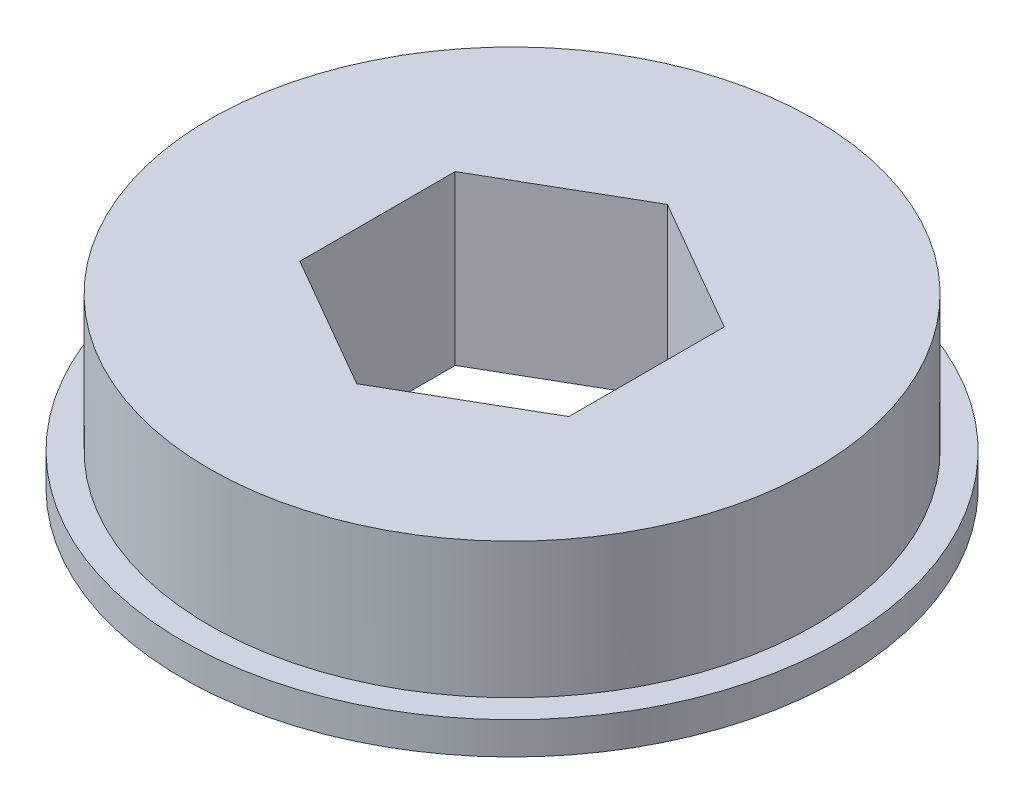
ISO-10303-21;
HEADER;
FILE_DESCRIPTION(('STEP AP214'),'2;1');
FILE_NAME('part.step','',(''),(''),'','','');
FILE_SCHEMA(('AUTOMOTIVE_DESIGN { 1 0 10303 214 1 1 1 1 }'));
ENDSEC;
DATA;
#1=APPLICATION_CONTEXT('core data for automotive mechanical design processes');
#2=APPLICATION_PROTOCOL_DEFINITION('international standard','automotive_design',2000,#1);
#3=PRODUCT_CONTEXT('',#1,'mechanical');
#4=PRODUCT('Part','Part','',(#3));
#5=PRODUCT_RELATED_PRODUCT_CATEGORY('part','',(#4));
#6=PRODUCT_DEFINITION_FORMATION('','',#4);
#7=PRODUCT_DEFINITION_CONTEXT('part definition',#1,'design');
#8=PRODUCT_DEFINITION('design','',#6,#7);
#9=PRODUCT_DEFINITION_SHAPE('','',#8);
#10=(LENGTH_UNIT() NAMED_UNIT(*) SI_UNIT(.MILLI.,.METRE.));
#11=(NAMED_UNIT(*) PLANE_ANGLE_UNIT() SI_UNIT($,.RADIAN.));
#12=(NAMED_UNIT(*) SI_UNIT($,.STERADIAN.) SOLID_ANGLE_UNIT());
#13=UNCERTAINTY_MEASURE_WITH_UNIT(LENGTH_MEASURE(1.E-05),#10,'distance_accuracy_value','');
#14=(GEOMETRIC_REPRESENTATION_CONTEXT(3) GLOBAL_UNCERTAINTY_ASSIGNED_CONTEXT((#13)) GLOBAL_UNIT_ASSIGNED_CONTEXT((#10,
#11,#12)) REPRESENTATION_CONTEXT('',''));
#15=CARTESIAN_POINT('',(0.,0.,0.));
#16=DIRECTION('',(0.,0.,1.));
#17=DIRECTION('',(1.,0.,0.));
#18=AXIS2_PLACEMENT_3D('',#15,#16,#17);
#19=CARTESIAN_POINT('',(0.,7.9248,0.));
#20=DIRECTION('',(0.,-1.,0.));
#21=DIRECTION('',(0.,0.,-1.));
#22=AXIS2_PLACEMENT_3D('',#19,#20,#21);
#23=CYLINDRICAL_SURFACE('',#22,14.2875);
#24=CARTESIAN_POINT('',(0.,7.9248,0.));
#25=DIRECTION('',(0.,1.,0.));
#26=DIRECTION('',(0.,0.,1.));
#27=AXIS2_PLACEMENT_3D('',#24,#25,#26);
#28=CIRCLE('',#27,14.2875);
#29=CARTESIAN_POINT('',(0.,7.9248,14.2875));
#30=VERTEX_POINT('',#29);
#31=EDGE_CURVE('E44',#30,#30,#28,.T.);
#32=ORIENTED_EDGE('',*,*,#31,.F.);
#33=EDGE_LOOP('',(#32));
#34=FACE_BOUND('',#33,.T.);
#35=CARTESIAN_POINT('',(0.,1.524,0.));
#36=DIRECTION('',(0.,-1.,0.));
#37=DIRECTION('',(0.,0.,-1.));
#38=AXIS2_PLACEMENT_3D('',#35,#36,#37);
#39=CIRCLE('',#38,14.2875);
#40=CARTESIAN_POINT('',(0.,1.524,-14.2875));
#41=VERTEX_POINT('',#40);
#42=EDGE_CURVE('E11',#41,#41,#39,.T.);
#43=ORIENTED_EDGE('',*,*,#42,.F.);
#44=EDGE_LOOP('',(#43));
#45=FACE_BOUND('',#44,.T.);
#46=ADVANCED_FACE('F37',(#34,#45),#23,.T.);
#47=CARTESIAN_POINT('',(0.,7.9248,0.));
#48=DIRECTION('',(0.,1.,0.));
#49=DIRECTION('',(0.,0.,1.));
#50=AXIS2_PLACEMENT_3D('',#47,#48,#49);
#51=PLANE('',#50);
#52=ORIENTED_EDGE('',*,*,#31,.T.);
#53=EDGE_LOOP('',(#52));
#54=FACE_BOUND('',#53,.T.);
#55=DIRECTION('',(0.,0.,-1.));
#56=VECTOR('',#55,1.);
#57=CARTESIAN_POINT('',(6.35,7.9248,3.66617420935413));
#58=LINE('',#57,#56);
#59=CARTESIAN_POINT('',(6.35,7.9248,3.66617420935413));
#60=VERTEX_POINT('',#59);
#61=CARTESIAN_POINT('',(6.35,7.9248,-3.66617420935412));
#62=VERTEX_POINT('',#61);
#63=EDGE_CURVE('E97',#60,#62,#58,.T.);
#64=ORIENTED_EDGE('',*,*,#63,.F.);
#65=DIRECTION('',(0.866025403784439,0.,-0.499999999999999));
#66=VECTOR('',#65,1.);
#67=CARTESIAN_POINT('',(0.,7.9248,7.33234841870825));
#68=LINE('',#67,#66);
#69=CARTESIAN_POINT('',(0.,7.9248,7.33234841870825));
#70=VERTEX_POINT('',#69);
#71=EDGE_CURVE('E89',#70,#60,#68,.T.);
#72=ORIENTED_EDGE('',*,*,#71,.F.);
#73=DIRECTION('',(0.866025403784438,0.,0.5));
#74=VECTOR('',#73,1.);
#75=CARTESIAN_POINT('',(-6.35,7.9248,3.66617420935412));
#76=LINE('',#75,#74);
#77=CARTESIAN_POINT('',(-6.35,7.9248,3.66617420935412));
#78=VERTEX_POINT('',#77);
#79=EDGE_CURVE('E119',#78,#70,#76,.T.);
#80=ORIENTED_EDGE('',*,*,#79,.F.);
#81=DIRECTION('',(0.,0.,1.));
#82=VECTOR('',#81,1.);
#83=CARTESIAN_POINT('',(-6.35,7.9248,-3.66617420935413));
#84=LINE('',#83,#82);
#85=CARTESIAN_POINT('',(-6.35,7.9248,-3.66617420935413));
#86=VERTEX_POINT('',#85);
#87=EDGE_CURVE('E117',#86,#78,#84,.T.);
#88=ORIENTED_EDGE('',*,*,#87,.F.);
#89=DIRECTION('',(-0.866025403784439,0.,0.499999999999999));
#90=VECTOR('',#89,1.);
#91=CARTESIAN_POINT('',(0.,7.9248,-7.33234841870825));
#92=LINE('',#91,#90);
#93=CARTESIAN_POINT('',(0.,7.9248,-7.33234841870825));
#94=VERTEX_POINT('',#93);
#95=EDGE_CURVE('E112',#94,#86,#92,.T.);
#96=ORIENTED_EDGE('',*,*,#95,.F.);
#97=DIRECTION('',(-0.866025403784438,0.,-0.500000000000001));
#98=VECTOR('',#97,1.);
#99=CARTESIAN_POINT('',(6.35,7.9248,-3.66617420935412));
#100=LINE('',#99,#98);
#101=EDGE_CURVE('E110',#62,#94,#100,.T.);
#102=ORIENTED_EDGE('',*,*,#101,.F.);
#103=EDGE_LOOP('',(#64,#72,#80,#88,#96,#102));
#104=FACE_BOUND('',#103,.T.);
#105=ADVANCED_FACE('F108',(#54,#104),#51,.T.);
#106=CARTESIAN_POINT('',(0.,0.,0.));
#107=DIRECTION('',(0.,1.,0.));
#108=DIRECTION('',(0.,0.,1.));
#109=AXIS2_PLACEMENT_3D('',#106,#107,#108);
#110=PLANE('',#109);
#111=DIRECTION('',(0.866025403784439,0.,-0.499999999999999));
#112=VECTOR('',#111,1.);
#113=CARTESIAN_POINT('',(0.,0.,7.33234841870825));
#114=LINE('',#113,#112);
#115=CARTESIAN_POINT('',(0.,0.,7.33234841870825));
#116=VERTEX_POINT('',#115);
#117=CARTESIAN_POINT('',(6.35,0.,3.66617420935413));
#118=VERTEX_POINT('',#117);
#119=EDGE_CURVE('E59',#116,#118,#114,.T.);
#120=ORIENTED_EDGE('',*,*,#119,.T.);
#121=DIRECTION('',(0.,0.,-1.));
#122=VECTOR('',#121,1.);
#123=CARTESIAN_POINT('',(6.35,0.,3.66617420935413));
#124=LINE('',#123,#122);
#125=CARTESIAN_POINT('',(6.35,0.,-3.66617420935412));
#126=VERTEX_POINT('',#125);
#127=EDGE_CURVE('E104',#118,#126,#124,.T.);
#128=ORIENTED_EDGE('',*,*,#127,.T.);
#129=DIRECTION('',(-0.866025403784438,0.,-0.500000000000001));
#130=VECTOR('',#129,1.);
#131=CARTESIAN_POINT('',(6.35,0.,-3.66617420935412));
#132=LINE('',#131,#130);
#133=CARTESIAN_POINT('',(0.,0.,-7.33234841870825));
#134=VERTEX_POINT('',#133);
#135=EDGE_CURVE('E124',#126,#134,#132,.T.);
#136=ORIENTED_EDGE('',*,*,#135,.T.);
#137=DIRECTION('',(-0.866025403784439,0.,0.499999999999999));
#138=VECTOR('',#137,1.);
#139=CARTESIAN_POINT('',(0.,0.,-7.33234841870825));
#140=LINE('',#139,#138);
#141=CARTESIAN_POINT('',(-6.35,0.,-3.66617420935413));
#142=VERTEX_POINT('',#141);
#143=EDGE_CURVE('E127',#134,#142,#140,.T.);
#144=ORIENTED_EDGE('',*,*,#143,.T.);
#145=DIRECTION('',(0.,0.,1.));
#146=VECTOR('',#145,1.);
#147=CARTESIAN_POINT('',(-6.35,0.,-3.66617420935413));
#148=LINE('',#147,#146);
#149=CARTESIAN_POINT('',(-6.35,0.,3.66617420935412));
#150=VERTEX_POINT('',#149);
#151=EDGE_CURVE('E130',#142,#150,#148,.T.);
#152=ORIENTED_EDGE('',*,*,#151,.T.);
#153=DIRECTION('',(0.866025403784438,0.,0.5));
#154=VECTOR('',#153,1.);
#155=CARTESIAN_POINT('',(-6.35,0.,3.66617420935412));
#156=LINE('',#155,#154);
#157=EDGE_CURVE('E98',#150,#116,#156,.T.);
#158=ORIENTED_EDGE('',*,*,#157,.T.);
#159=EDGE_LOOP('',(#120,#128,#136,#144,#152,#158));
#160=FACE_BOUND('',#159,.T.);
#161=CARTESIAN_POINT('',(0.,0.,0.));
#162=DIRECTION('',(0.,-1.,0.));
#163=DIRECTION('',(0.,0.,-1.));
#164=AXIS2_PLACEMENT_3D('',#161,#162,#163);
#165=CIRCLE('',#164,15.5575);
#166=CARTESIAN_POINT('',(0.,0.,-15.5575));
#167=VERTEX_POINT('',#166);
#168=EDGE_CURVE('E157',#167,#167,#165,.T.);
#169=ORIENTED_EDGE('',*,*,#168,.T.);
#170=EDGE_LOOP('',(#169));
#171=FACE_BOUND('',#170,.T.);
#172=ADVANCED_FACE('F162',(#160,#171),#110,.F.);
#173=CARTESIAN_POINT('',(0.,7.9248,7.33234841870825));
#174=DIRECTION('',(-0.499999999999999,0.,-0.866025403784439));
#175=DIRECTION('',(-0.866025403784439,0.,0.499999999999999));
#176=AXIS2_PLACEMENT_3D('',#173,#174,#175);
#177=PLANE('',#176);
#178=ORIENTED_EDGE('',*,*,#119,.F.);
#179=DIRECTION('',(0.,-1.,0.));
#180=VECTOR('',#179,1.);
#181=CARTESIAN_POINT('',(0.,7.9248,7.33234841870825));
#182=LINE('',#181,#180);
#183=EDGE_CURVE('E93',#70,#116,#182,.T.);
#184=ORIENTED_EDGE('',*,*,#183,.F.);
#185=ORIENTED_EDGE('',*,*,#71,.T.);
#186=DIRECTION('',(0.,-1.,0.));
#187=VECTOR('',#186,1.);
#188=CARTESIAN_POINT('',(6.35,7.9248,3.66617420935413));
#189=LINE('',#188,#187);
#190=EDGE_CURVE('E92',#60,#118,#189,.T.);
#191=ORIENTED_EDGE('',*,*,#190,.T.);
#192=EDGE_LOOP('',(#178,#184,#185,#191));
#193=FACE_BOUND('',#192,.T.);
#194=ADVANCED_FACE('F91',(#193),#177,.T.);
#195=CARTESIAN_POINT('',(6.35,7.9248,3.66617420935413));
#196=DIRECTION('',(-1.,0.,0.));
#197=DIRECTION('',(0.,0.,1.));
#198=AXIS2_PLACEMENT_3D('',#195,#196,#197);
#199=PLANE('',#198);
#200=ORIENTED_EDGE('',*,*,#127,.F.);
#201=ORIENTED_EDGE('',*,*,#190,.F.);
#202=ORIENTED_EDGE('',*,*,#63,.T.);
#203=DIRECTION('',(0.,-1.,0.));
#204=VECTOR('',#203,1.);
#205=CARTESIAN_POINT('',(6.35,7.9248,-3.66617420935412));
#206=LINE('',#205,#204);
#207=EDGE_CURVE('E105',#62,#126,#206,.T.);
#208=ORIENTED_EDGE('',*,*,#207,.T.);
#209=EDGE_LOOP('',(#200,#201,#202,#208));
#210=FACE_BOUND('',#209,.T.);
#211=ADVANCED_FACE('F101',(#210),#199,.T.);
#212=CARTESIAN_POINT('',(6.35,7.9248,-3.66617420935412));
#213=DIRECTION('',(-0.500000000000001,0.,0.866025403784438));
#214=DIRECTION('',(0.866025403784438,0.,0.500000000000001));
#215=AXIS2_PLACEMENT_3D('',#212,#213,#214);
#216=PLANE('',#215);
#217=ORIENTED_EDGE('',*,*,#135,.F.);
#218=ORIENTED_EDGE('',*,*,#207,.F.);
#219=ORIENTED_EDGE('',*,*,#101,.T.);
#220=DIRECTION('',(0.,-1.,0.));
#221=VECTOR('',#220,1.);
#222=CARTESIAN_POINT('',(0.,7.9248,-7.33234841870825));
#223=LINE('',#222,#221);
#224=EDGE_CURVE('E139',#94,#134,#223,.T.);
#225=ORIENTED_EDGE('',*,*,#224,.T.);
#226=EDGE_LOOP('',(#217,#218,#219,#225));
#227=FACE_BOUND('',#226,.T.);
#228=ADVANCED_FACE('F179',(#227),#216,.T.);
#229=CARTESIAN_POINT('',(0.,7.9248,-7.33234841870825));
#230=DIRECTION('',(0.499999999999999,0.,0.866025403784439));
#231=DIRECTION('',(0.866025403784439,0.,-0.499999999999999));
#232=AXIS2_PLACEMENT_3D('',#229,#230,#231);
#233=PLANE('',#232);
#234=ORIENTED_EDGE('',*,*,#143,.F.);
#235=ORIENTED_EDGE('',*,*,#224,.F.);
#236=ORIENTED_EDGE('',*,*,#95,.T.);
#237=DIRECTION('',(0.,-1.,0.));
#238=VECTOR('',#237,1.);
#239=CARTESIAN_POINT('',(-6.35,7.9248,-3.66617420935413));
#240=LINE('',#239,#238);
#241=EDGE_CURVE('E137',#86,#142,#240,.T.);
#242=ORIENTED_EDGE('',*,*,#241,.T.);
#243=EDGE_LOOP('',(#234,#235,#236,#242));
#244=FACE_BOUND('',#243,.T.);
#245=ADVANCED_FACE('F175',(#244),#233,.T.);
#246=CARTESIAN_POINT('',(-6.35,7.9248,-3.66617420935413));
#247=DIRECTION('',(1.,0.,0.));
#248=DIRECTION('',(0.,0.,-1.));
#249=AXIS2_PLACEMENT_3D('',#246,#247,#248);
#250=PLANE('',#249);
#251=ORIENTED_EDGE('',*,*,#151,.F.);
#252=ORIENTED_EDGE('',*,*,#241,.F.);
#253=ORIENTED_EDGE('',*,*,#87,.T.);
#254=DIRECTION('',(0.,-1.,0.));
#255=VECTOR('',#254,1.);
#256=CARTESIAN_POINT('',(-6.35,7.9248,3.66617420935412));
#257=LINE('',#256,#255);
#258=EDGE_CURVE('E51',#78,#150,#257,.T.);
#259=ORIENTED_EDGE('',*,*,#258,.T.);
#260=EDGE_LOOP('',(#251,#252,#253,#259));
#261=FACE_BOUND('',#260,.T.);
#262=ADVANCED_FACE('F170',(#261),#250,.T.);
#263=CARTESIAN_POINT('',(-6.35,7.9248,3.66617420935412));
#264=DIRECTION('',(0.5,0.,-0.866025403784438));
#265=DIRECTION('',(-0.866025403784438,0.,-0.5));
#266=AXIS2_PLACEMENT_3D('',#263,#264,#265);
#267=PLANE('',#266);
#268=ORIENTED_EDGE('',*,*,#157,.F.);
#269=ORIENTED_EDGE('',*,*,#258,.F.);
#270=ORIENTED_EDGE('',*,*,#79,.T.);
#271=ORIENTED_EDGE('',*,*,#183,.T.);
#272=EDGE_LOOP('',(#268,#269,#270,#271));
#273=FACE_BOUND('',#272,.T.);
#274=ADVANCED_FACE('F165',(#273),#267,.T.);
#275=CARTESIAN_POINT('',(0.,1.524,0.));
#276=DIRECTION('',(0.,-1.,0.));
#277=DIRECTION('',(0.,0.,-1.));
#278=AXIS2_PLACEMENT_3D('',#275,#276,#277);
#279=CYLINDRICAL_SURFACE('',#278,15.5575);
#280=CARTESIAN_POINT('',(0.,1.524,0.));
#281=DIRECTION('',(0.,-1.,0.));
#282=DIRECTION('',(0.,0.,-1.));
#283=AXIS2_PLACEMENT_3D('',#280,#281,#282);
#284=CIRCLE('',#283,15.5575);
#285=CARTESIAN_POINT('',(0.,1.524,-15.5575));
#286=VERTEX_POINT('',#285);
#287=EDGE_CURVE('E122',#286,#286,#284,.T.);
#288=CARTESIAN_POINT('',(0.,1.524,-15.5575));
#289=CARTESIAN_POINT('',(0.,1.508125,-15.5575));
#290=CARTESIAN_POINT('',(0.,1.49225,-15.5575));
#291=CARTESIAN_POINT('',(0.,1.4605,-15.5575));
#292=CARTESIAN_POINT('',(0.,1.444625,-15.5575));
#293=CARTESIAN_POINT('',(0.,1.412875,-15.5575));
#294=CARTESIAN_POINT('',(0.,1.397,-15.5575));
#295=CARTESIAN_POINT('',(0.,1.36525,-15.5575));
#296=CARTESIAN_POINT('',(0.,1.349375,-15.5575));
#297=CARTESIAN_POINT('',(0.,1.317625,-15.5575));
#298=CARTESIAN_POINT('',(0.,1.30175,-15.5575));
#299=CARTESIAN_POINT('',(0.,1.27,-15.5575));
#300=CARTESIAN_POINT('',(0.,1.254125,-15.5575));
#301=CARTESIAN_POINT('',(0.,1.222375,-15.5575));
#302=CARTESIAN_POINT('',(0.,1.2065,-15.5575));
#303=CARTESIAN_POINT('',(0.,1.17475,-15.5575));
#304=CARTESIAN_POINT('',(0.,1.158875,-15.5575));
#305=CARTESIAN_POINT('',(0.,1.127125,-15.5575));
#306=CARTESIAN_POINT('',(0.,1.11125,-15.5575));
#307=CARTESIAN_POINT('',(0.,1.0795,-15.5575));
#308=CARTESIAN_POINT('',(0.,1.063625,-15.5575));
#309=CARTESIAN_POINT('',(0.,1.031875,-15.5575));
#310=CARTESIAN_POINT('',(0.,1.016,-15.5575));
#311=CARTESIAN_POINT('',(0.,0.98425,-15.5575));
#312=CARTESIAN_POINT('',(0.,0.968375,-15.5575));
#313=CARTESIAN_POINT('',(0.,0.936625,-15.5575));
#314=CARTESIAN_POINT('',(0.,0.92075,-15.5575));
#315=CARTESIAN_POINT('',(0.,0.889,-15.5575));
#316=CARTESIAN_POINT('',(0.,0.873125,-15.5575));
#317=CARTESIAN_POINT('',(0.,0.841375,-15.5575));
#318=CARTESIAN_POINT('',(0.,0.8255,-15.5575));
#319=CARTESIAN_POINT('',(0.,0.79375,-15.5575));
#320=CARTESIAN_POINT('',(0.,0.777875,-15.5575));
#321=CARTESIAN_POINT('',(0.,0.746125,-15.5575));
#322=CARTESIAN_POINT('',(0.,0.73025,-15.5575));
#323=CARTESIAN_POINT('',(0.,0.6985,-15.5575));
#324=CARTESIAN_POINT('',(0.,0.682625,-15.5575));
#325=CARTESIAN_POINT('',(0.,0.650875,-15.5575));
#326=CARTESIAN_POINT('',(0.,0.635,-15.5575));
#327=CARTESIAN_POINT('',(0.,0.60325,-15.5575));
#328=CARTESIAN_POINT('',(0.,0.587375,-15.5575));
#329=CARTESIAN_POINT('',(0.,0.555625,-15.5575));
#330=CARTESIAN_POINT('',(0.,0.53975,-15.5575));
#331=CARTESIAN_POINT('',(0.,0.508,-15.5575));
#332=CARTESIAN_POINT('',(0.,0.492125,-15.5575));
#333=CARTESIAN_POINT('',(0.,0.460375,-15.5575));
#334=CARTESIAN_POINT('',(0.,0.4445,-15.5575));
#335=CARTESIAN_POINT('',(0.,0.41275,-15.5575));
#336=CARTESIAN_POINT('',(0.,0.396875,-15.5575));
#337=CARTESIAN_POINT('',(0.,0.365125,-15.5575));
#338=CARTESIAN_POINT('',(0.,0.34925,-15.5575));
#339=CARTESIAN_POINT('',(0.,0.3175,-15.5575));
#340=CARTESIAN_POINT('',(0.,0.301625,-15.5575));
#341=CARTESIAN_POINT('',(0.,0.269875,-15.5575));
#342=CARTESIAN_POINT('',(0.,0.254,-15.5575));
#343=CARTESIAN_POINT('',(0.,0.22225,-15.5575));
#344=CARTESIAN_POINT('',(0.,0.206375,-15.5575));
#345=CARTESIAN_POINT('',(0.,0.174625,-15.5575));
#346=CARTESIAN_POINT('',(0.,0.15875,-15.5575));
#347=CARTESIAN_POINT('',(0.,0.127,-15.5575));
#348=CARTESIAN_POINT('',(0.,0.111125,-15.5575));
#349=CARTESIAN_POINT('',(0.,0.079375,-15.5575));
#350=CARTESIAN_POINT('',(0.,0.0635,-15.5575));
#351=CARTESIAN_POINT('',(0.,0.0317499999999999,-15.5575));
#352=CARTESIAN_POINT('',(0.,0.015875,-15.5575));
#353=CARTESIAN_POINT('',(0.,0.,-15.5575));
#354=B_SPLINE_CURVE_WITH_KNOTS('',3,(#288,#289,#290,#291,#292,#293,#294,#295,#296,#297,#298,
#299,#300,#301,#302,#303,#304,#305,#306,#307,#308,#309,#310,#311,#312,#313,#314,#315,#316,#317,
#318,#319,#320,#321,#322,#323,#324,#325,#326,#327,#328,#329,#330,#331,#332,#333,#334,#335,#336,
#337,#338,#339,#340,#341,#342,#343,#344,#345,#346,#347,#348,#349,#350,#351,#352,#353),
.UNSPECIFIED.,.F.,.F.,(4,2,2,2,2,2,2,2,2,2,2,2,2,2,2,2,2,2,2,2,2,2,2,2,2,2,2,2,2,2,2,2,4),(0.,
0.0476249999999999,0.0952499999999998,0.142875,0.1905,0.238125,0.28575,0.333375,0.381,0.428625,
0.47625,0.523875,0.5715,0.619125,0.66675,0.714375,0.762,0.809625,0.85725,0.904875,0.9525,
1.000125,1.04775,1.095375,1.143,1.190625,1.23825,1.285875,1.3335,1.381125,1.42875,1.476375,
1.524),.UNSPECIFIED.);
#355=EDGE_CURVE('BSEAM152',#286,#167,#354,.T.);
#356=ORIENTED_EDGE('',*,*,#287,.T.);
#357=ORIENTED_EDGE('',*,*,#168,.F.);
#358=ORIENTED_EDGE('',*,*,#355,.T.);
#359=ORIENTED_EDGE('',*,*,#355,.F.);
#360=EDGE_LOOP('',(#356,#358,#357,#359));
#361=FACE_BOUND('',#360,.T.);
#362=ADVANCED_FACE('F152',(#361),#279,.T.);
#363=CARTESIAN_POINT('',(0.,1.524,0.));
#364=DIRECTION('',(0.,-1.,0.));
#365=DIRECTION('',(0.,0.,-1.));
#366=AXIS2_PLACEMENT_3D('',#363,#364,#365);
#367=PLANE('',#366);
#368=ORIENTED_EDGE('',*,*,#42,.T.);
#369=EDGE_LOOP('',(#368));
#370=FACE_BOUND('',#369,.T.);
#371=ORIENTED_EDGE('',*,*,#287,.F.);
#372=EDGE_LOOP('',(#371));
#373=FACE_BOUND('',#372,.T.);
#374=ADVANCED_FACE('F149',(#370,#373),#367,.F.);
#375=CLOSED_SHELL('',(#46,#105,#172,#194,#211,#228,#245,#262,#274,#362,#374));
#376=MANIFOLD_SOLID_BREP('B2',#375);
#377=ADVANCED_BREP_SHAPE_REPRESENTATION('',(#18,#376),#14);
#378=SHAPE_DEFINITION_REPRESENTATION(#9,#377);
ENDSEC;
END-ISO-10303-21;
